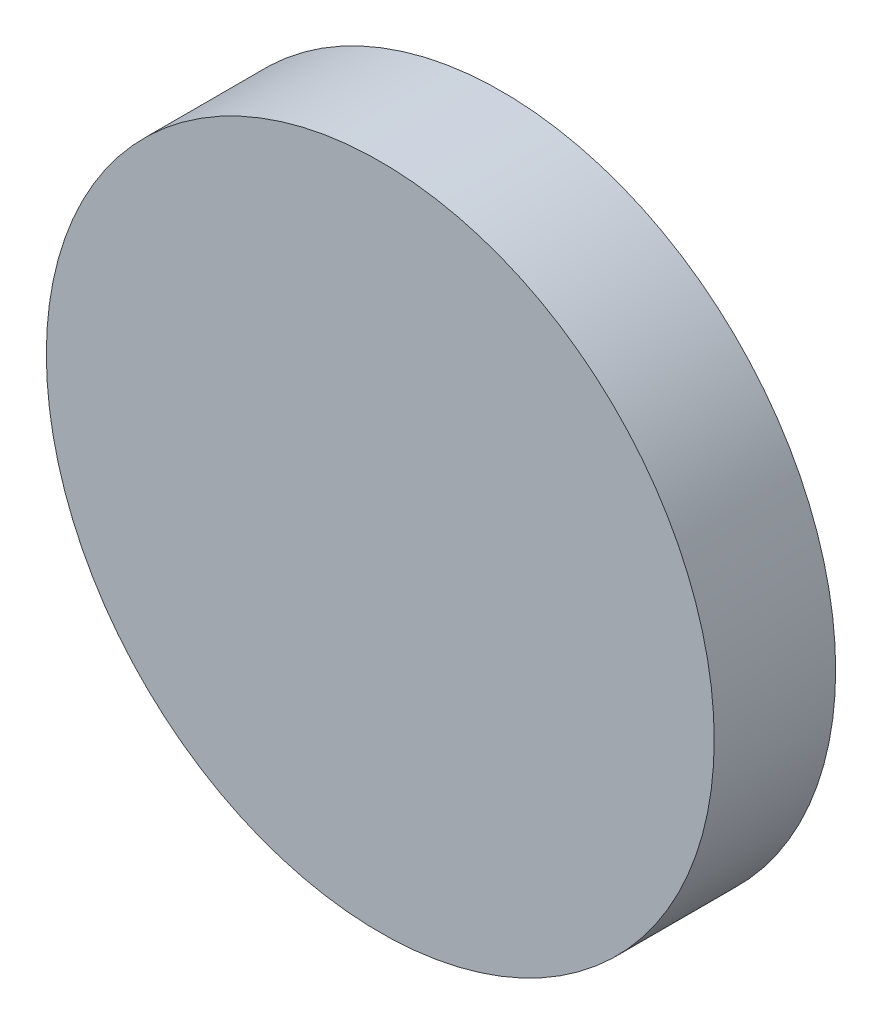
ISO-10303-21;
HEADER;
FILE_DESCRIPTION(('STEP AP214'),'2;1');
FILE_NAME('part.step','',(''),(''),'','','');
FILE_SCHEMA(('AUTOMOTIVE_DESIGN { 1 0 10303 214 1 1 1 1 }'));
ENDSEC;
DATA;
#1=APPLICATION_CONTEXT('core data for automotive mechanical design processes');
#2=APPLICATION_PROTOCOL_DEFINITION('international standard','automotive_design',2000,#1);
#3=PRODUCT_CONTEXT('',#1,'mechanical');
#4=PRODUCT('Part','Part','',(#3));
#5=PRODUCT_RELATED_PRODUCT_CATEGORY('part','',(#4));
#6=PRODUCT_DEFINITION_FORMATION('','',#4);
#7=PRODUCT_DEFINITION_CONTEXT('part definition',#1,'design');
#8=PRODUCT_DEFINITION('design','',#6,#7);
#9=PRODUCT_DEFINITION_SHAPE('','',#8);
#10=(LENGTH_UNIT() NAMED_UNIT(*) SI_UNIT(.MILLI.,.METRE.));
#11=(NAMED_UNIT(*) PLANE_ANGLE_UNIT() SI_UNIT($,.RADIAN.));
#12=(NAMED_UNIT(*) SI_UNIT($,.STERADIAN.) SOLID_ANGLE_UNIT());
#13=UNCERTAINTY_MEASURE_WITH_UNIT(LENGTH_MEASURE(1.E-05),#10,'distance_accuracy_value','');
#14=(GEOMETRIC_REPRESENTATION_CONTEXT(3) GLOBAL_UNCERTAINTY_ASSIGNED_CONTEXT((#13)) GLOBAL_UNIT_ASSIGNED_CONTEXT((#10,
#11,#12)) REPRESENTATION_CONTEXT('',''));
#15=CARTESIAN_POINT('',(0.,0.,0.));
#16=DIRECTION('',(0.,0.,1.));
#17=DIRECTION('',(1.,0.,0.));
#18=AXIS2_PLACEMENT_3D('',#15,#16,#17);
#19=CARTESIAN_POINT('',(0.,0.,12.7));
#20=DIRECTION('',(0.,0.,-1.));
#21=DIRECTION('',(-1.,0.,0.));
#22=AXIS2_PLACEMENT_3D('',#19,#20,#21);
#23=CYLINDRICAL_SURFACE('',#22,34.925);
#24=CARTESIAN_POINT('',(0.,0.,12.7));
#25=DIRECTION('',(0.,0.,1.));
#26=DIRECTION('',(1.,0.,0.));
#27=AXIS2_PLACEMENT_3D('',#24,#25,#26);
#28=CIRCLE('',#27,34.925);
#29=CARTESIAN_POINT('',(34.925,0.,12.7));
#30=VERTEX_POINT('',#29);
#31=EDGE_CURVE('E10',#30,#30,#28,.T.);
#32=ORIENTED_EDGE('',*,*,#31,.F.);
#33=EDGE_LOOP('',(#32));
#34=FACE_BOUND('',#33,.T.);
#35=CARTESIAN_POINT('',(0.,0.,0.));
#36=DIRECTION('',(0.,0.,1.));
#37=DIRECTION('',(1.,0.,0.));
#38=AXIS2_PLACEMENT_3D('',#35,#36,#37);
#39=CIRCLE('',#38,34.925);
#40=CARTESIAN_POINT('',(34.925,0.,0.));
#41=VERTEX_POINT('',#40);
#42=EDGE_CURVE('E40',#41,#41,#39,.T.);
#43=ORIENTED_EDGE('',*,*,#42,.T.);
#44=EDGE_LOOP('',(#43));
#45=FACE_BOUND('',#44,.T.);
#46=ADVANCED_FACE('F37',(#34,#45),#23,.T.);
#47=CARTESIAN_POINT('',(0.,0.,12.7));
#48=DIRECTION('',(0.,0.,1.));
#49=DIRECTION('',(1.,0.,0.));
#50=AXIS2_PLACEMENT_3D('',#47,#48,#49);
#51=PLANE('',#50);
#52=ORIENTED_EDGE('',*,*,#31,.T.);
#53=EDGE_LOOP('',(#52));
#54=FACE_BOUND('',#53,.T.);
#55=ADVANCED_FACE('F54',(#54),#51,.T.);
#56=CARTESIAN_POINT('',(0.,0.,0.));
#57=DIRECTION('',(0.,0.,1.));
#58=DIRECTION('',(1.,0.,0.));
#59=AXIS2_PLACEMENT_3D('',#56,#57,#58);
#60=PLANE('',#59);
#61=ORIENTED_EDGE('',*,*,#42,.F.);
#62=EDGE_LOOP('',(#61));
#63=FACE_BOUND('',#62,.T.);
#64=ADVANCED_FACE('F52',(#63),#60,.F.);
#65=CLOSED_SHELL('',(#46,#55,#64));
#66=MANIFOLD_SOLID_BREP('B2',#65);
#67=ADVANCED_BREP_SHAPE_REPRESENTATION('',(#18,#66),#14);
#68=SHAPE_DEFINITION_REPRESENTATION(#9,#67);
ENDSEC;
END-ISO-10303-21;
